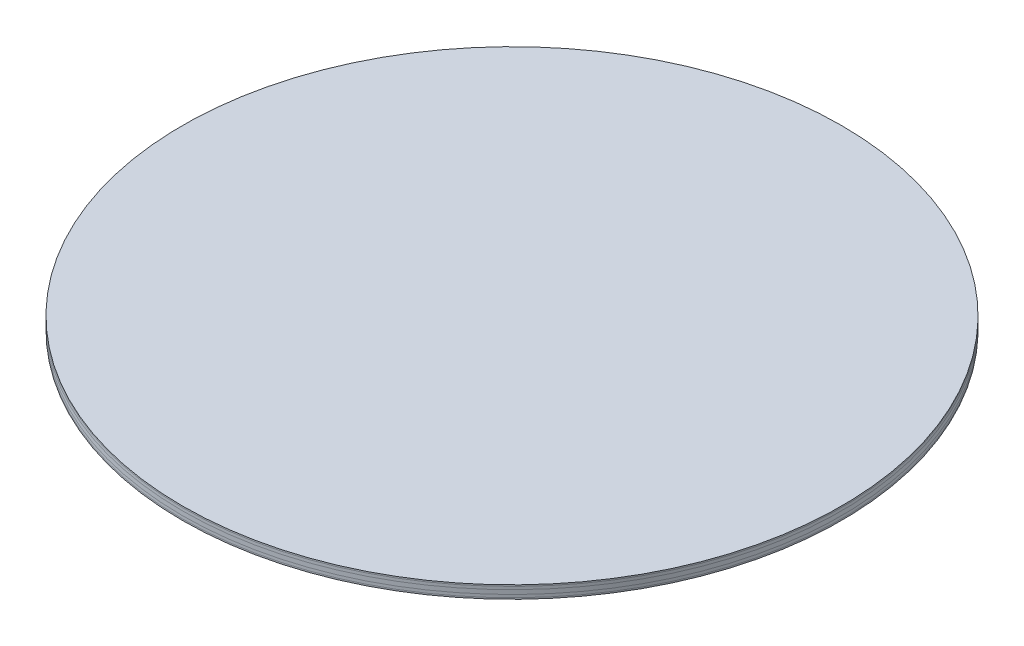
ISO-10303-21;
HEADER;
FILE_DESCRIPTION(('STEP AP214'),'2;1');
FILE_NAME('part.step','',(''),(''),'','','');
FILE_SCHEMA(('AUTOMOTIVE_DESIGN { 1 0 10303 214 1 1 1 1 }'));
ENDSEC;
DATA;
#1=APPLICATION_CONTEXT('core data for automotive mechanical design processes');
#2=APPLICATION_PROTOCOL_DEFINITION('international standard','automotive_design',2000,#1);
#3=PRODUCT_CONTEXT('',#1,'mechanical');
#4=PRODUCT('Part','Part','',(#3));
#5=PRODUCT_RELATED_PRODUCT_CATEGORY('part','',(#4));
#6=PRODUCT_DEFINITION_FORMATION('','',#4);
#7=PRODUCT_DEFINITION_CONTEXT('part definition',#1,'design');
#8=PRODUCT_DEFINITION('design','',#6,#7);
#9=PRODUCT_DEFINITION_SHAPE('','',#8);
#10=(LENGTH_UNIT() NAMED_UNIT(*) SI_UNIT(.MILLI.,.METRE.));
#11=(NAMED_UNIT(*) PLANE_ANGLE_UNIT() SI_UNIT($,.RADIAN.));
#12=(NAMED_UNIT(*) SI_UNIT($,.STERADIAN.) SOLID_ANGLE_UNIT());
#13=UNCERTAINTY_MEASURE_WITH_UNIT(LENGTH_MEASURE(1.E-05),#10,'distance_accuracy_value','');
#14=(GEOMETRIC_REPRESENTATION_CONTEXT(3) GLOBAL_UNCERTAINTY_ASSIGNED_CONTEXT((#13)) GLOBAL_UNIT_ASSIGNED_CONTEXT((#10,
#11,#12)) REPRESENTATION_CONTEXT('',''));
#15=CARTESIAN_POINT('',(0.,0.,0.));
#16=DIRECTION('',(0.,0.,1.));
#17=DIRECTION('',(1.,0.,0.));
#18=AXIS2_PLACEMENT_3D('',#15,#16,#17);
#19=CARTESIAN_POINT('',(0.,0.,0.));
#20=DIRECTION('',(0.,1.,0.));
#21=DIRECTION('',(0.,0.,1.));
#22=AXIS2_PLACEMENT_3D('',#19,#20,#21);
#23=PLANE('',#22);
#24=CARTESIAN_POINT('',(0.,0.,0.));
#25=DIRECTION('',(0.,1.,0.));
#26=DIRECTION('',(0.,0.,1.));
#27=AXIS2_PLACEMENT_3D('',#24,#25,#26);
#28=CIRCLE('',#27,500.);
#29=CARTESIAN_POINT('',(0.,0.,500.));
#30=VERTEX_POINT('',#29);
#31=EDGE_CURVE('E65',#30,#30,#28,.T.);
#32=ORIENTED_EDGE('',*,*,#31,.T.);
#33=EDGE_LOOP('',(#32));
#34=FACE_BOUND('',#33,.T.);
#35=ADVANCED_FACE('F58',(#34),#23,.T.);
#36=CARTESIAN_POINT('',(0.,-19.05,0.));
#37=DIRECTION('',(0.,1.,0.));
#38=DIRECTION('',(0.,0.,1.));
#39=AXIS2_PLACEMENT_3D('',#36,#37,#38);
#40=CYLINDRICAL_SURFACE('',#39,500.);
#41=CARTESIAN_POINT('',(0.,-2.11666666666654,0.));
#42=DIRECTION('',(0.,-1.,0.));
#43=DIRECTION('',(1.,0.,0.));
#44=AXIS2_PLACEMENT_3D('',#41,#42,#43);
#45=CIRCLE('',#44,500.);
#46=CARTESIAN_POINT('',(0.,-2.11666666666654,500.));
#47=VERTEX_POINT('',#46);
#48=EDGE_CURVE('E11',#47,#47,#45,.T.);
#49=CARTESIAN_POINT('',(0.,-2.11666666666654,500.));
#50=CARTESIAN_POINT('',(0.,-2.09461805555543,500.));
#51=CARTESIAN_POINT('',(0.,-2.07256944444432,500.));
#52=CARTESIAN_POINT('',(0.,-2.0284722222221,500.));
#53=CARTESIAN_POINT('',(0.,-2.00642361111099,500.));
#54=CARTESIAN_POINT('',(0.,-1.96232638888877,500.));
#55=CARTESIAN_POINT('',(0.,-1.94027777777766,500.));
#56=CARTESIAN_POINT('',(0.,-1.89618055555544,500.));
#57=CARTESIAN_POINT('',(0.,-1.87413194444433,500.));
#58=CARTESIAN_POINT('',(0.,-1.83003472222211,500.));
#59=CARTESIAN_POINT('',(0.,-1.807986111111,500.));
#60=CARTESIAN_POINT('',(0.,-1.76388888888878,500.));
#61=CARTESIAN_POINT('',(0.,-1.74184027777767,500.));
#62=CARTESIAN_POINT('',(0.,-1.69774305555545,500.));
#63=CARTESIAN_POINT('',(0.,-1.67569444444434,500.));
#64=CARTESIAN_POINT('',(0.,-1.63159722222212,500.));
#65=CARTESIAN_POINT('',(0.,-1.60954861111101,500.));
#66=CARTESIAN_POINT('',(0.,-1.56545138888879,500.));
#67=CARTESIAN_POINT('',(0.,-1.54340277777768,500.));
#68=CARTESIAN_POINT('',(0.,-1.49930555555547,500.));
#69=CARTESIAN_POINT('',(0.,-1.47725694444436,500.));
#70=CARTESIAN_POINT('',(0.,-1.43315972222214,500.));
#71=CARTESIAN_POINT('',(0.,-1.41111111111103,500.));
#72=CARTESIAN_POINT('',(0.,-1.36701388888881,500.));
#73=CARTESIAN_POINT('',(0.,-1.3449652777777,500.));
#74=CARTESIAN_POINT('',(0.,-1.30086805555548,500.));
#75=CARTESIAN_POINT('',(0.,-1.27881944444437,500.));
#76=CARTESIAN_POINT('',(0.,-1.23472222222215,500.));
#77=CARTESIAN_POINT('',(0.,-1.21267361111104,500.));
#78=CARTESIAN_POINT('',(0.,-1.16857638888882,500.));
#79=CARTESIAN_POINT('',(0.,-1.14652777777771,500.));
#80=CARTESIAN_POINT('',(0.,-1.10243055555549,500.));
#81=CARTESIAN_POINT('',(0.,-1.08038194444438,500.));
#82=CARTESIAN_POINT('',(0.,-1.03628472222216,500.));
#83=CARTESIAN_POINT('',(0.,-1.01423611111105,500.));
#84=CARTESIAN_POINT('',(0.,-0.970138888888829,500.));
#85=CARTESIAN_POINT('',(0.,-0.94809027777772,500.));
#86=CARTESIAN_POINT('',(0.,-0.9039930555555,500.));
#87=CARTESIAN_POINT('',(0.,-0.88194444444439,500.));
#88=CARTESIAN_POINT('',(0.,-0.83784722222217,500.));
#89=CARTESIAN_POINT('',(0.,-0.815798611111061,500.));
#90=CARTESIAN_POINT('',(0.,-0.771701388888841,500.));
#91=CARTESIAN_POINT('',(0.,-0.749652777777731,500.));
#92=CARTESIAN_POINT('',(0.,-0.705555555555511,500.));
#93=CARTESIAN_POINT('',(0.,-0.683506944444402,500.));
#94=CARTESIAN_POINT('',(0.,-0.639409722222182,500.));
#95=CARTESIAN_POINT('',(0.,-0.617361111111072,500.));
#96=CARTESIAN_POINT('',(0.,-0.573263888888853,500.));
#97=CARTESIAN_POINT('',(0.,-0.551215277777745,500.));
#98=CARTESIAN_POINT('',(0.,-0.507118055555526,500.));
#99=CARTESIAN_POINT('',(0.,-0.485069444444416,500.));
#100=CARTESIAN_POINT('',(0.,-0.440972222222197,500.));
#101=CARTESIAN_POINT('',(0.,-0.418923611111087,500.));
#102=CARTESIAN_POINT('',(0.,-0.374826388888867,500.));
#103=CARTESIAN_POINT('',(0.,-0.352777777777757,500.));
#104=CARTESIAN_POINT('',(0.,-0.308680555555538,500.));
#105=CARTESIAN_POINT('',(0.,-0.286631944444428,500.));
#106=CARTESIAN_POINT('',(0.,-0.242534722222208,500.));
#107=CARTESIAN_POINT('',(0.,-0.220486111111098,500.));
#108=CARTESIAN_POINT('',(0.,-0.176388888888879,500.));
#109=CARTESIAN_POINT('',(0.,-0.154340277777769,500.));
#110=CARTESIAN_POINT('',(0.,-0.110243055555549,500.));
#111=CARTESIAN_POINT('',(0.,-0.0881944444444394,500.));
#112=CARTESIAN_POINT('',(0.,-0.0440972222222197,500.));
#113=CARTESIAN_POINT('',(0.,-0.0220486111111098,500.));
#114=CARTESIAN_POINT('',(0.,0.,500.));
#115=B_SPLINE_CURVE_WITH_KNOTS('',3,(#49,#50,#51,#52,#53,#54,#55,#56,#57,#58,#59,#60,#61,#62,
#63,#64,#65,#66,#67,#68,#69,#70,#71,#72,#73,#74,#75,#76,#77,#78,#79,#80,#81,#82,#83,#84,#85,#86,
#87,#88,#89,#90,#91,#92,#93,#94,#95,#96,#97,#98,#99,#100,#101,#102,#103,#104,#105,#106,#107,
#108,#109,#110,#111,#112,#113,#114),.UNSPECIFIED.,.F.,.F.,(4,2,2,2,2,2,2,2,2,2,2,2,2,2,2,2,2,2,
2,2,2,2,2,2,2,2,2,2,2,2,2,2,4),(0.,0.0661458333333295,0.132291666666659,0.198437499999989,
0.264583333333318,0.330729166666648,0.396874999999977,0.463020833333307,0.529166666666636,
0.595312499999962,0.661458333333292,0.727604166666621,0.793749999999951,0.85989583333328,
0.92604166666661,0.992187499999939,1.05833333333327,1.1244791666666,1.19062499999993,
1.25677083333326,1.32291666666659,1.38906249999992,1.45520833333325,1.52135416666658,
1.5874999999999,1.65364583333323,1.71979166666656,1.78593749999989,1.85208333333322,
1.91822916666655,1.98437499999988,2.05052083333321,2.11666666666654),.UNSPECIFIED.);
#116=EDGE_CURVE('BSEAM72',#47,#30,#115,.T.);
#117=ORIENTED_EDGE('',*,*,#48,.F.);
#118=ORIENTED_EDGE('',*,*,#31,.F.);
#119=ORIENTED_EDGE('',*,*,#116,.T.);
#120=ORIENTED_EDGE('',*,*,#116,.F.);
#121=EDGE_LOOP('',(#117,#119,#118,#120));
#122=FACE_BOUND('',#121,.T.);
#123=ADVANCED_FACE('F72',(#122),#40,.T.);
#124=CARTESIAN_POINT('',(-670.56,-2.11666666666667,-609.61));
#125=DIRECTION('',(0.,-1.,0.));
#126=DIRECTION('',(1.,0.,0.));
#127=AXIS2_PLACEMENT_3D('',#124,#125,#126);
#128=PLANE('',#127);
#129=ORIENTED_EDGE('',*,*,#48,.T.);
#130=EDGE_LOOP('',(#129));
#131=FACE_BOUND('',#130,.T.);
#132=ADVANCED_FACE('F60',(#131),#128,.T.);
#133=CLOSED_SHELL('',(#35,#123,#132));
#134=MANIFOLD_SOLID_BREP('B2',#133);
#135=CARTESIAN_POINT('',(0.,-19.05,0.));
#136=DIRECTION('',(0.,1.,0.));
#137=DIRECTION('',(0.,0.,1.));
#138=AXIS2_PLACEMENT_3D('',#135,#136,#137);
#139=PLANE('',#138);
#140=CARTESIAN_POINT('',(0.,-19.05,0.));
#141=DIRECTION('',(0.,1.,0.));
#142=DIRECTION('',(0.,0.,1.));
#143=AXIS2_PLACEMENT_3D('',#140,#141,#142);
#144=CIRCLE('',#143,500.);
#145=CARTESIAN_POINT('',(0.,-19.05,500.));
#146=VERTEX_POINT('',#145);
#147=EDGE_CURVE('E126',#146,#146,#144,.T.);
#148=ORIENTED_EDGE('',*,*,#147,.F.);
#149=EDGE_LOOP('',(#148));
#150=FACE_BOUND('',#149,.T.);
#151=ADVANCED_FACE('F119',(#150),#139,.F.);
#152=CARTESIAN_POINT('',(0.,-19.05,0.));
#153=DIRECTION('',(0.,1.,0.));
#154=DIRECTION('',(0.,0.,1.));
#155=AXIS2_PLACEMENT_3D('',#152,#153,#154);
#156=CYLINDRICAL_SURFACE('',#155,500.);
#157=CARTESIAN_POINT('',(0.,-16.9333333333332,0.));
#158=DIRECTION('',(0.,-1.,0.));
#159=DIRECTION('',(1.,0.,0.));
#160=AXIS2_PLACEMENT_3D('',#157,#158,#159);
#161=CIRCLE('',#160,500.);
#162=CARTESIAN_POINT('',(0.,-16.9333333333332,500.));
#163=VERTEX_POINT('',#162);
#164=EDGE_CURVE('E57',#163,#163,#161,.T.);
#165=CARTESIAN_POINT('',(0.,-19.05,500.));
#166=CARTESIAN_POINT('',(0.,-19.0279513888889,500.));
#167=CARTESIAN_POINT('',(0.,-19.0059027777778,500.));
#168=CARTESIAN_POINT('',(0.,-18.9618055555556,500.));
#169=CARTESIAN_POINT('',(0.,-18.9397569444444,500.));
#170=CARTESIAN_POINT('',(0.,-18.8956597222222,500.));
#171=CARTESIAN_POINT('',(0.,-18.8736111111111,500.));
#172=CARTESIAN_POINT('',(0.,-18.8295138888889,500.));
#173=CARTESIAN_POINT('',(0.,-18.8074652777778,500.));
#174=CARTESIAN_POINT('',(0.,-18.7633680555555,500.));
#175=CARTESIAN_POINT('',(0.,-18.7413194444444,500.));
#176=CARTESIAN_POINT('',(0.,-18.6972222222222,500.));
#177=CARTESIAN_POINT('',(0.,-18.6751736111111,500.));
#178=CARTESIAN_POINT('',(0.,-18.6310763888889,500.));
#179=CARTESIAN_POINT('',(0.,-18.6090277777778,500.));
#180=CARTESIAN_POINT('',(0.,-18.5649305555555,500.));
#181=CARTESIAN_POINT('',(0.,-18.5428819444444,500.));
#182=CARTESIAN_POINT('',(0.,-18.4987847222222,500.));
#183=CARTESIAN_POINT('',(0.,-18.4767361111111,500.));
#184=CARTESIAN_POINT('',(0.,-18.4326388888889,500.));
#185=CARTESIAN_POINT('',(0.,-18.4105902777777,500.));
#186=CARTESIAN_POINT('',(0.,-18.3664930555555,500.));
#187=CARTESIAN_POINT('',(0.,-18.3444444444444,500.));
#188=CARTESIAN_POINT('',(0.,-18.3003472222222,500.));
#189=CARTESIAN_POINT('',(0.,-18.2782986111111,500.));
#190=CARTESIAN_POINT('',(0.,-18.2342013888888,500.));
#191=CARTESIAN_POINT('',(0.,-18.2121527777777,500.));
#192=CARTESIAN_POINT('',(0.,-18.1680555555555,500.));
#193=CARTESIAN_POINT('',(0.,-18.1460069444444,500.));
#194=CARTESIAN_POINT('',(0.,-18.1019097222222,500.));
#195=CARTESIAN_POINT('',(0.,-18.0798611111111,500.));
#196=CARTESIAN_POINT('',(0.,-18.0357638888888,500.));
#197=CARTESIAN_POINT('',(0.,-18.0137152777777,500.));
#198=CARTESIAN_POINT('',(0.,-17.9696180555555,500.));
#199=CARTESIAN_POINT('',(0.,-17.9475694444444,500.));
#200=CARTESIAN_POINT('',(0.,-17.9034722222222,500.));
#201=CARTESIAN_POINT('',(0.,-17.881423611111,500.));
#202=CARTESIAN_POINT('',(0.,-17.8373263888888,500.));
#203=CARTESIAN_POINT('',(0.,-17.8152777777777,500.));
#204=CARTESIAN_POINT('',(0.,-17.7711805555555,500.));
#205=CARTESIAN_POINT('',(0.,-17.7491319444444,500.));
#206=CARTESIAN_POINT('',(0.,-17.7050347222221,500.));
#207=CARTESIAN_POINT('',(0.,-17.682986111111,500.));
#208=CARTESIAN_POINT('',(0.,-17.6388888888888,500.));
#209=CARTESIAN_POINT('',(0.,-17.6168402777777,500.));
#210=CARTESIAN_POINT('',(0.,-17.5727430555555,500.));
#211=CARTESIAN_POINT('',(0.,-17.5506944444444,500.));
#212=CARTESIAN_POINT('',(0.,-17.5065972222221,500.));
#213=CARTESIAN_POINT('',(0.,-17.484548611111,500.));
#214=CARTESIAN_POINT('',(0.,-17.4404513888888,500.));
#215=CARTESIAN_POINT('',(0.,-17.4184027777777,500.));
#216=CARTESIAN_POINT('',(0.,-17.3743055555555,500.));
#217=CARTESIAN_POINT('',(0.,-17.3522569444443,500.));
#218=CARTESIAN_POINT('',(0.,-17.3081597222221,500.));
#219=CARTESIAN_POINT('',(0.,-17.286111111111,500.));
#220=CARTESIAN_POINT('',(0.,-17.2420138888888,500.));
#221=CARTESIAN_POINT('',(0.,-17.2199652777777,500.));
#222=CARTESIAN_POINT('',(0.,-17.1758680555554,500.));
#223=CARTESIAN_POINT('',(0.,-17.1538194444443,500.));
#224=CARTESIAN_POINT('',(0.,-17.1097222222221,500.));
#225=CARTESIAN_POINT('',(0.,-17.087673611111,500.));
#226=CARTESIAN_POINT('',(0.,-17.0435763888888,500.));
#227=CARTESIAN_POINT('',(0.,-17.0215277777777,500.));
#228=CARTESIAN_POINT('',(0.,-16.9774305555554,500.));
#229=CARTESIAN_POINT('',(0.,-16.9553819444443,500.));
#230=CARTESIAN_POINT('',(0.,-16.9333333333332,500.));
#231=B_SPLINE_CURVE_WITH_KNOTS('',3,(#165,#166,#167,#168,#169,#170,#171,#172,#173,#174,#175,
#176,#177,#178,#179,#180,#181,#182,#183,#184,#185,#186,#187,#188,#189,#190,#191,#192,#193,#194,
#195,#196,#197,#198,#199,#200,#201,#202,#203,#204,#205,#206,#207,#208,#209,#210,#211,#212,#213,
#214,#215,#216,#217,#218,#219,#220,#221,#222,#223,#224,#225,#226,#227,#228,#229,#230),
.UNSPECIFIED.,.F.,.F.,(4,2,2,2,2,2,2,2,2,2,2,2,2,2,2,2,2,2,2,2,2,2,2,2,2,2,2,2,2,2,2,2,4),(0.,
0.0661458333333365,0.132291666666673,0.198437500000009,0.264583333333349,0.330729166666686,
0.396875000000022,0.463020833333359,0.529166666666699,0.595312500000035,0.661458333333371,
0.727604166666708,0.793750000000048,0.859895833333384,0.926041666666721,0.992187500000057,
1.0583333333334,1.12447916666673,1.19062500000007,1.25677083333341,1.32291666666675,
1.38906250000008,1.45520833333342,1.52135416666676,1.5875000000001,1.65364583333343,
1.71979166666677,1.78593750000011,1.85208333333344,1.91822916666678,1.98437500000012,
2.05052083333345,2.11666666666679),.UNSPECIFIED.);
#232=EDGE_CURVE('BSEAM132',#146,#163,#231,.T.);
#233=ORIENTED_EDGE('',*,*,#147,.T.);
#234=ORIENTED_EDGE('',*,*,#164,.T.);
#235=ORIENTED_EDGE('',*,*,#232,.T.);
#236=ORIENTED_EDGE('',*,*,#232,.F.);
#237=EDGE_LOOP('',(#233,#235,#234,#236));
#238=FACE_BOUND('',#237,.T.);
#239=ADVANCED_FACE('F132',(#238),#156,.T.);
#240=CARTESIAN_POINT('',(-670.56,-16.9333333333333,-609.61));
#241=DIRECTION('',(0.,-1.,0.));
#242=DIRECTION('',(1.,0.,0.));
#243=AXIS2_PLACEMENT_3D('',#240,#241,#242);
#244=PLANE('',#243);
#245=ORIENTED_EDGE('',*,*,#164,.F.);
#246=EDGE_LOOP('',(#245));
#247=FACE_BOUND('',#246,.T.);
#248=ADVANCED_FACE('F121',(#247),#244,.F.);
#249=CLOSED_SHELL('',(#151,#239,#248));
#250=MANIFOLD_SOLID_BREP('B6',#249);
#251=CARTESIAN_POINT('',(-670.56,-16.9333333333333,-609.61));
#252=DIRECTION('',(0.,-1.,0.));
#253=DIRECTION('',(1.,0.,0.));
#254=AXIS2_PLACEMENT_3D('',#251,#252,#253);
#255=PLANE('',#254);
#256=CARTESIAN_POINT('',(0.,-16.9333333333332,0.));
#257=DIRECTION('',(0.,-1.,0.));
#258=DIRECTION('',(1.,0.,0.));
#259=AXIS2_PLACEMENT_3D('',#256,#257,#258);
#260=CIRCLE('',#259,500.);
#261=CARTESIAN_POINT('',(0.,-16.9333333333332,500.));
#262=VERTEX_POINT('',#261);
#263=EDGE_CURVE('E183',#262,#262,#260,.T.);
#264=ORIENTED_EDGE('',*,*,#263,.T.);
#265=EDGE_LOOP('',(#264));
#266=FACE_BOUND('',#265,.T.);
#267=ADVANCED_FACE('F180',(#266),#255,.T.);
#268=CARTESIAN_POINT('',(0.,-19.05,0.));
#269=DIRECTION('',(0.,1.,0.));
#270=DIRECTION('',(0.,0.,1.));
#271=AXIS2_PLACEMENT_3D('',#268,#269,#270);
#272=CYLINDRICAL_SURFACE('',#271,500.);
#273=CARTESIAN_POINT('',(0.,-12.6999999999999,0.));
#274=DIRECTION('',(0.,-1.,0.));
#275=DIRECTION('',(1.,0.,0.));
#276=AXIS2_PLACEMENT_3D('',#273,#274,#275);
#277=CIRCLE('',#276,500.);
#278=CARTESIAN_POINT('',(0.,-12.6999999999999,500.));
#279=VERTEX_POINT('',#278);
#280=EDGE_CURVE('E118',#279,#279,#277,.T.);
#281=CARTESIAN_POINT('',(0.,-16.9333333333332,500.));
#282=CARTESIAN_POINT('',(0.,-16.889236111111,500.));
#283=CARTESIAN_POINT('',(0.,-16.8451388888888,500.));
#284=CARTESIAN_POINT('',(0.,-16.7569444444443,500.));
#285=CARTESIAN_POINT('',(0.,-16.7128472222221,500.));
#286=CARTESIAN_POINT('',(0.,-16.6246527777777,500.));
#287=CARTESIAN_POINT('',(0.,-16.5805555555554,500.));
#288=CARTESIAN_POINT('',(0.,-16.492361111111,500.));
#289=CARTESIAN_POINT('',(0.,-16.4482638888888,500.));
#290=CARTESIAN_POINT('',(0.,-16.3600694444443,500.));
#291=CARTESIAN_POINT('',(0.,-16.3159722222221,500.));
#292=CARTESIAN_POINT('',(0.,-16.2277777777776,500.));
#293=CARTESIAN_POINT('',(0.,-16.1836805555554,500.));
#294=CARTESIAN_POINT('',(0.,-16.095486111111,500.));
#295=CARTESIAN_POINT('',(0.,-16.0513888888888,500.));
#296=CARTESIAN_POINT('',(0.,-15.9631944444443,500.));
#297=CARTESIAN_POINT('',(0.,-15.9190972222221,500.));
#298=CARTESIAN_POINT('',(0.,-15.8309027777777,500.));
#299=CARTESIAN_POINT('',(0.,-15.7868055555554,500.));
#300=CARTESIAN_POINT('',(0.,-15.698611111111,500.));
#301=CARTESIAN_POINT('',(0.,-15.6545138888888,500.));
#302=CARTESIAN_POINT('',(0.,-15.5663194444443,500.));
#303=CARTESIAN_POINT('',(0.,-15.5222222222221,500.));
#304=CARTESIAN_POINT('',(0.,-15.4340277777777,500.));
#305=CARTESIAN_POINT('',(0.,-15.3899305555554,500.));
#306=CARTESIAN_POINT('',(0.,-15.301736111111,500.));
#307=CARTESIAN_POINT('',(0.,-15.2576388888888,500.));
#308=CARTESIAN_POINT('',(0.,-15.1694444444443,500.));
#309=CARTESIAN_POINT('',(0.,-15.1253472222221,500.));
#310=CARTESIAN_POINT('',(0.,-15.0371527777777,500.));
#311=CARTESIAN_POINT('',(0.,-14.9930555555554,500.));
#312=CARTESIAN_POINT('',(0.,-14.904861111111,500.));
#313=CARTESIAN_POINT('',(0.,-14.8607638888888,500.));
#314=CARTESIAN_POINT('',(0.,-14.7725694444443,500.));
#315=CARTESIAN_POINT('',(0.,-14.7284722222221,500.));
#316=CARTESIAN_POINT('',(0.,-14.6402777777777,500.));
#317=CARTESIAN_POINT('',(0.,-14.5961805555554,500.));
#318=CARTESIAN_POINT('',(0.,-14.507986111111,500.));
#319=CARTESIAN_POINT('',(0.,-14.4638888888888,500.));
#320=CARTESIAN_POINT('',(0.,-14.3756944444443,500.));
#321=CARTESIAN_POINT('',(0.,-14.3315972222221,500.));
#322=CARTESIAN_POINT('',(0.,-14.2434027777777,500.));
#323=CARTESIAN_POINT('',(0.,-14.1993055555554,500.));
#324=CARTESIAN_POINT('',(0.,-14.111111111111,500.));
#325=CARTESIAN_POINT('',(0.,-14.0670138888888,500.));
#326=CARTESIAN_POINT('',(0.,-13.9788194444443,500.));
#327=CARTESIAN_POINT('',(0.,-13.9347222222221,500.));
#328=CARTESIAN_POINT('',(0.,-13.8465277777777,500.));
#329=CARTESIAN_POINT('',(0.,-13.8024305555554,500.));
#330=CARTESIAN_POINT('',(0.,-13.714236111111,500.));
#331=CARTESIAN_POINT('',(0.,-13.6701388888888,500.));
#332=CARTESIAN_POINT('',(0.,-13.5819444444443,500.));
#333=CARTESIAN_POINT('',(0.,-13.5378472222221,500.));
#334=CARTESIAN_POINT('',(0.,-13.4496527777777,500.));
#335=CARTESIAN_POINT('',(0.,-13.4055555555554,500.));
#336=CARTESIAN_POINT('',(0.,-13.317361111111,500.));
#337=CARTESIAN_POINT('',(0.,-13.2732638888888,500.));
#338=CARTESIAN_POINT('',(0.,-13.1850694444443,500.));
#339=CARTESIAN_POINT('',(0.,-13.1409722222221,500.));
#340=CARTESIAN_POINT('',(0.,-13.0527777777777,500.));
#341=CARTESIAN_POINT('',(0.,-13.0086805555554,500.));
#342=CARTESIAN_POINT('',(0.,-12.920486111111,500.));
#343=CARTESIAN_POINT('',(0.,-12.8763888888888,500.));
#344=CARTESIAN_POINT('',(0.,-12.7881944444443,500.));
#345=CARTESIAN_POINT('',(0.,-12.7440972222221,500.));
#346=CARTESIAN_POINT('',(0.,-12.6999999999999,500.));
#347=B_SPLINE_CURVE_WITH_KNOTS('',3,(#281,#282,#283,#284,#285,#286,#287,#288,#289,#290,#291,
#292,#293,#294,#295,#296,#297,#298,#299,#300,#301,#302,#303,#304,#305,#306,#307,#308,#309,#310,
#311,#312,#313,#314,#315,#316,#317,#318,#319,#320,#321,#322,#323,#324,#325,#326,#327,#328,#329,
#330,#331,#332,#333,#334,#335,#336,#337,#338,#339,#340,#341,#342,#343,#344,#345,#346),
.UNSPECIFIED.,.F.,.F.,(4,2,2,2,2,2,2,2,2,2,2,2,2,2,2,2,2,2,2,2,2,2,2,2,2,2,2,2,2,2,2,2,4),(0.,
0.132291666666666,0.264583333333332,0.396874999999998,0.529166666666664,0.661458333333333,
0.793749999999999,0.926041666666665,1.05833333333333,1.190625,1.32291666666666,1.45520833333333,
1.5875,1.71979166666666,1.85208333333333,1.984375,2.11666666666667,2.24895833333333,2.38125,
2.51354166666666,2.64583333333333,2.778125,2.91041666666667,3.04270833333333,3.175,
3.30729166666666,3.43958333333333,3.571875,3.70416666666666,3.83645833333333,3.96875,
4.10104166666666,4.23333333333333),.UNSPECIFIED.);
#348=EDGE_CURVE('BSEAM193',#262,#279,#347,.T.);
#349=ORIENTED_EDGE('',*,*,#263,.F.);
#350=ORIENTED_EDGE('',*,*,#280,.T.);
#351=ORIENTED_EDGE('',*,*,#348,.T.);
#352=ORIENTED_EDGE('',*,*,#348,.F.);
#353=EDGE_LOOP('',(#349,#351,#350,#352));
#354=FACE_BOUND('',#353,.T.);
#355=ADVANCED_FACE('F193',(#354),#272,.T.);
#356=CARTESIAN_POINT('',(-670.56,-12.7,-609.61));
#357=DIRECTION('',(0.,-1.,0.));
#358=DIRECTION('',(1.,0.,0.));
#359=AXIS2_PLACEMENT_3D('',#356,#357,#358);
#360=PLANE('',#359);
#361=ORIENTED_EDGE('',*,*,#280,.F.);
#362=EDGE_LOOP('',(#361));
#363=FACE_BOUND('',#362,.T.);
#364=ADVANCED_FACE('F195',(#363),#360,.F.);
#365=CLOSED_SHELL('',(#267,#355,#364));
#366=MANIFOLD_SOLID_BREP('B52',#365);
#367=CARTESIAN_POINT('',(-670.56,-12.7,-609.61));
#368=DIRECTION('',(0.,-1.,0.));
#369=DIRECTION('',(1.,0.,0.));
#370=AXIS2_PLACEMENT_3D('',#367,#368,#369);
#371=PLANE('',#370);
#372=CARTESIAN_POINT('',(0.,-12.6999999999999,0.));
#373=DIRECTION('',(0.,-1.,0.));
#374=DIRECTION('',(1.,0.,0.));
#375=AXIS2_PLACEMENT_3D('',#372,#373,#374);
#376=CIRCLE('',#375,500.);
#377=CARTESIAN_POINT('',(0.,-12.6999999999999,500.));
#378=VERTEX_POINT('',#377);
#379=EDGE_CURVE('E243',#378,#378,#376,.T.);
#380=ORIENTED_EDGE('',*,*,#379,.T.);
#381=EDGE_LOOP('',(#380));
#382=FACE_BOUND('',#381,.T.);
#383=ADVANCED_FACE('F240',(#382),#371,.T.);
#384=CARTESIAN_POINT('',(0.,-19.05,0.));
#385=DIRECTION('',(0.,1.,0.));
#386=DIRECTION('',(0.,0.,1.));
#387=AXIS2_PLACEMENT_3D('',#384,#385,#386);
#388=CYLINDRICAL_SURFACE('',#387,500.);
#389=CARTESIAN_POINT('',(0.,-6.34999999999988,0.));
#390=DIRECTION('',(0.,-1.,0.));
#391=DIRECTION('',(1.,0.,0.));
#392=AXIS2_PLACEMENT_3D('',#389,#390,#391);
#393=CIRCLE('',#392,500.);
#394=CARTESIAN_POINT('',(0.,-6.34999999999988,500.));
#395=VERTEX_POINT('',#394);
#396=EDGE_CURVE('E179',#395,#395,#393,.T.);
#397=CARTESIAN_POINT('',(0.,-12.6999999999999,500.));
#398=CARTESIAN_POINT('',(0.,-12.6338541666665,500.));
#399=CARTESIAN_POINT('',(0.,-12.5677083333332,500.));
#400=CARTESIAN_POINT('',(0.,-12.4354166666665,500.));
#401=CARTESIAN_POINT('',(0.,-12.3692708333332,500.));
#402=CARTESIAN_POINT('',(0.,-12.2369791666665,500.));
#403=CARTESIAN_POINT('',(0.,-12.1708333333332,500.));
#404=CARTESIAN_POINT('',(0.,-12.0385416666665,500.));
#405=CARTESIAN_POINT('',(0.,-11.9723958333332,500.));
#406=CARTESIAN_POINT('',(0.,-11.8401041666665,500.));
#407=CARTESIAN_POINT('',(0.,-11.7739583333332,500.));
#408=CARTESIAN_POINT('',(0.,-11.6416666666665,500.));
#409=CARTESIAN_POINT('',(0.,-11.5755208333332,500.));
#410=CARTESIAN_POINT('',(0.,-11.4432291666665,500.));
#411=CARTESIAN_POINT('',(0.,-11.3770833333332,500.));
#412=CARTESIAN_POINT('',(0.,-11.2447916666665,500.));
#413=CARTESIAN_POINT('',(0.,-11.1786458333332,500.));
#414=CARTESIAN_POINT('',(0.,-11.0463541666665,500.));
#415=CARTESIAN_POINT('',(0.,-10.9802083333332,500.));
#416=CARTESIAN_POINT('',(0.,-10.8479166666665,500.));
#417=CARTESIAN_POINT('',(0.,-10.7817708333332,500.));
#418=CARTESIAN_POINT('',(0.,-10.6494791666665,500.));
#419=CARTESIAN_POINT('',(0.,-10.5833333333332,500.));
#420=CARTESIAN_POINT('',(0.,-10.4510416666665,500.));
#421=CARTESIAN_POINT('',(0.,-10.3848958333332,500.));
#422=CARTESIAN_POINT('',(0.,-10.2526041666665,500.));
#423=CARTESIAN_POINT('',(0.,-10.1864583333332,500.));
#424=CARTESIAN_POINT('',(0.,-10.0541666666665,500.));
#425=CARTESIAN_POINT('',(0.,-9.98802083333321,500.));
#426=CARTESIAN_POINT('',(0.,-9.85572916666654,500.));
#427=CARTESIAN_POINT('',(0.,-9.78958333333321,500.));
#428=CARTESIAN_POINT('',(0.,-9.65729166666654,500.));
#429=CARTESIAN_POINT('',(0.,-9.59114583333321,500.));
#430=CARTESIAN_POINT('',(0.,-9.45885416666654,500.));
#431=CARTESIAN_POINT('',(0.,-9.39270833333321,500.));
#432=CARTESIAN_POINT('',(0.,-9.26041666666654,500.));
#433=CARTESIAN_POINT('',(0.,-9.19427083333321,500.));
#434=CARTESIAN_POINT('',(0.,-9.06197916666654,500.));
#435=CARTESIAN_POINT('',(0.,-8.99583333333321,500.));
#436=CARTESIAN_POINT('',(0.,-8.86354166666654,500.));
#437=CARTESIAN_POINT('',(0.,-8.79739583333321,500.));
#438=CARTESIAN_POINT('',(0.,-8.66510416666654,500.));
#439=CARTESIAN_POINT('',(0.,-8.59895833333321,500.));
#440=CARTESIAN_POINT('',(0.,-8.46666666666654,500.));
#441=CARTESIAN_POINT('',(0.,-8.40052083333321,500.));
#442=CARTESIAN_POINT('',(0.,-8.26822916666655,500.));
#443=CARTESIAN_POINT('',(0.,-8.20208333333321,500.));
#444=CARTESIAN_POINT('',(0.,-8.06979166666654,500.));
#445=CARTESIAN_POINT('',(0.,-8.00364583333321,500.));
#446=CARTESIAN_POINT('',(0.,-7.87135416666654,500.));
#447=CARTESIAN_POINT('',(0.,-7.80520833333321,500.));
#448=CARTESIAN_POINT('',(0.,-7.67291666666654,500.));
#449=CARTESIAN_POINT('',(0.,-7.60677083333321,500.));
#450=CARTESIAN_POINT('',(0.,-7.47447916666655,500.));
#451=CARTESIAN_POINT('',(0.,-7.40833333333321,500.));
#452=CARTESIAN_POINT('',(0.,-7.27604166666654,500.));
#453=CARTESIAN_POINT('',(0.,-7.20989583333321,500.));
#454=CARTESIAN_POINT('',(0.,-7.07760416666654,500.));
#455=CARTESIAN_POINT('',(0.,-7.01145833333321,500.));
#456=CARTESIAN_POINT('',(0.,-6.87916666666654,500.));
#457=CARTESIAN_POINT('',(0.,-6.81302083333321,500.));
#458=CARTESIAN_POINT('',(0.,-6.68072916666654,500.));
#459=CARTESIAN_POINT('',(0.,-6.61458333333321,500.));
#460=CARTESIAN_POINT('',(0.,-6.48229166666654,500.));
#461=CARTESIAN_POINT('',(0.,-6.41614583333321,500.));
#462=CARTESIAN_POINT('',(0.,-6.34999999999988,500.));
#463=B_SPLINE_CURVE_WITH_KNOTS('',3,(#397,#398,#399,#400,#401,#402,#403,#404,#405,#406,#407,
#408,#409,#410,#411,#412,#413,#414,#415,#416,#417,#418,#419,#420,#421,#422,#423,#424,#425,#426,
#427,#428,#429,#430,#431,#432,#433,#434,#435,#436,#437,#438,#439,#440,#441,#442,#443,#444,#445,
#446,#447,#448,#449,#450,#451,#452,#453,#454,#455,#456,#457,#458,#459,#460,#461,#462),
.UNSPECIFIED.,.F.,.F.,(4,2,2,2,2,2,2,2,2,2,2,2,2,2,2,2,2,2,2,2,2,2,2,2,2,2,2,2,2,2,2,2,4),(0.,
0.198437499999999,0.396874999999998,0.595312499999999,0.793749999999999,0.992187499999998,
1.190625,1.3890625,1.5875,1.7859375,1.984375,2.1828125,2.38125,2.5796875,2.778125,2.9765625,
3.175,3.3734375,3.571875,3.7703125,3.96875,4.1671875,4.365625,4.5640625,4.7625,4.9609375,
5.159375,5.3578125,5.55625,5.7546875,5.953125,6.1515625,6.35),.UNSPECIFIED.);
#464=EDGE_CURVE('BSEAM255',#378,#395,#463,.T.);
#465=ORIENTED_EDGE('',*,*,#379,.F.);
#466=ORIENTED_EDGE('',*,*,#396,.T.);
#467=ORIENTED_EDGE('',*,*,#464,.T.);
#468=ORIENTED_EDGE('',*,*,#464,.F.);
#469=EDGE_LOOP('',(#465,#467,#466,#468));
#470=FACE_BOUND('',#469,.T.);
#471=ADVANCED_FACE('F255',(#470),#388,.T.);
#472=CARTESIAN_POINT('',(-670.56,-6.35,-609.61));
#473=DIRECTION('',(0.,-1.,0.));
#474=DIRECTION('',(1.,0.,0.));
#475=AXIS2_PLACEMENT_3D('',#472,#473,#474);
#476=PLANE('',#475);
#477=ORIENTED_EDGE('',*,*,#396,.F.);
#478=EDGE_LOOP('',(#477));
#479=FACE_BOUND('',#478,.T.);
#480=ADVANCED_FACE('F257',(#479),#476,.F.);
#481=CLOSED_SHELL('',(#383,#471,#480));
#482=MANIFOLD_SOLID_BREP('B113',#481);
#483=CARTESIAN_POINT('',(-670.56,-6.35,-609.61));
#484=DIRECTION('',(0.,-1.,0.));
#485=DIRECTION('',(1.,0.,0.));
#486=AXIS2_PLACEMENT_3D('',#483,#484,#485);
#487=PLANE('',#486);
#488=CARTESIAN_POINT('',(0.,-6.34999999999988,0.));
#489=DIRECTION('',(0.,-1.,0.));
#490=DIRECTION('',(1.,0.,0.));
#491=AXIS2_PLACEMENT_3D('',#488,#489,#490);
#492=CIRCLE('',#491,500.);
#493=CARTESIAN_POINT('',(0.,-6.34999999999988,500.));
#494=VERTEX_POINT('',#493);
#495=EDGE_CURVE('E299',#494,#494,#492,.T.);
#496=ORIENTED_EDGE('',*,*,#495,.T.);
#497=EDGE_LOOP('',(#496));
#498=FACE_BOUND('',#497,.T.);
#499=ADVANCED_FACE('F295',(#498),#487,.T.);
#500=CARTESIAN_POINT('',(0.,-19.05,0.));
#501=DIRECTION('',(0.,1.,0.));
#502=DIRECTION('',(0.,0.,1.));
#503=AXIS2_PLACEMENT_3D('',#500,#501,#502);
#504=CYLINDRICAL_SURFACE('',#503,500.);
#505=CARTESIAN_POINT('',(0.,-2.11666666666654,0.));
#506=DIRECTION('',(0.,-1.,0.));
#507=DIRECTION('',(1.,0.,0.));
#508=AXIS2_PLACEMENT_3D('',#505,#506,#507);
#509=CIRCLE('',#508,500.);
#510=CARTESIAN_POINT('',(0.,-2.11666666666654,500.));
#511=VERTEX_POINT('',#510);
#512=EDGE_CURVE('E239',#511,#511,#509,.T.);
#513=CARTESIAN_POINT('',(0.,-6.34999999999988,500.));
#514=CARTESIAN_POINT('',(0.,-6.30590277777766,500.));
#515=CARTESIAN_POINT('',(0.,-6.26180555555543,500.));
#516=CARTESIAN_POINT('',(0.,-6.17361111111099,500.));
#517=CARTESIAN_POINT('',(0.,-6.12951388888877,500.));
#518=CARTESIAN_POINT('',(0.,-6.04131944444432,500.));
#519=CARTESIAN_POINT('',(0.,-5.9972222222221,500.));
#520=CARTESIAN_POINT('',(0.,-5.90902777777765,500.));
#521=CARTESIAN_POINT('',(0.,-5.86493055555543,500.));
#522=CARTESIAN_POINT('',(0.,-5.77673611111099,500.));
#523=CARTESIAN_POINT('',(0.,-5.73263888888877,500.));
#524=CARTESIAN_POINT('',(0.,-5.64444444444432,500.));
#525=CARTESIAN_POINT('',(0.,-5.6003472222221,500.));
#526=CARTESIAN_POINT('',(0.,-5.51215277777766,500.));
#527=CARTESIAN_POINT('',(0.,-5.46805555555543,500.));
#528=CARTESIAN_POINT('',(0.,-5.37986111111099,500.));
#529=CARTESIAN_POINT('',(0.,-5.33576388888877,500.));
#530=CARTESIAN_POINT('',(0.,-5.24756944444432,500.));
#531=CARTESIAN_POINT('',(0.,-5.2034722222221,500.));
#532=CARTESIAN_POINT('',(0.,-5.11527777777765,500.));
#533=CARTESIAN_POINT('',(0.,-5.07118055555543,500.));
#534=CARTESIAN_POINT('',(0.,-4.98298611111099,500.));
#535=CARTESIAN_POINT('',(0.,-4.93888888888876,500.));
#536=CARTESIAN_POINT('',(0.,-4.85069444444432,500.));
#537=CARTESIAN_POINT('',(0.,-4.8065972222221,500.));
#538=CARTESIAN_POINT('',(0.,-4.71840277777765,500.));
#539=CARTESIAN_POINT('',(0.,-4.67430555555543,500.));
#540=CARTESIAN_POINT('',(0.,-4.58611111111099,500.));
#541=CARTESIAN_POINT('',(0.,-4.54201388888876,500.));
#542=CARTESIAN_POINT('',(0.,-4.45381944444432,500.));
#543=CARTESIAN_POINT('',(0.,-4.4097222222221,500.));
#544=CARTESIAN_POINT('',(0.,-4.32152777777765,500.));
#545=CARTESIAN_POINT('',(0.,-4.27743055555543,500.));
#546=CARTESIAN_POINT('',(0.,-4.18923611111098,500.));
#547=CARTESIAN_POINT('',(0.,-4.14513888888876,500.));
#548=CARTESIAN_POINT('',(0.,-4.05694444444432,500.));
#549=CARTESIAN_POINT('',(0.,-4.0128472222221,500.));
#550=CARTESIAN_POINT('',(0.,-3.92465277777765,500.));
#551=CARTESIAN_POINT('',(0.,-3.88055555555543,500.));
#552=CARTESIAN_POINT('',(0.,-3.79236111111098,500.));
#553=CARTESIAN_POINT('',(0.,-3.74826388888876,500.));
#554=CARTESIAN_POINT('',(0.,-3.66006944444432,500.));
#555=CARTESIAN_POINT('',(0.,-3.61597222222209,500.));
#556=CARTESIAN_POINT('',(0.,-3.52777777777765,500.));
#557=CARTESIAN_POINT('',(0.,-3.48368055555543,500.));
#558=CARTESIAN_POINT('',(0.,-3.39548611111098,500.));
#559=CARTESIAN_POINT('',(0.,-3.35138888888876,500.));
#560=CARTESIAN_POINT('',(0.,-3.26319444444432,500.));
#561=CARTESIAN_POINT('',(0.,-3.21909722222209,500.));
#562=CARTESIAN_POINT('',(0.,-3.13090277777765,500.));
#563=CARTESIAN_POINT('',(0.,-3.08680555555543,500.));
#564=CARTESIAN_POINT('',(0.,-2.99861111111098,500.));
#565=CARTESIAN_POINT('',(0.,-2.95451388888876,500.));
#566=CARTESIAN_POINT('',(0.,-2.86631944444432,500.));
#567=CARTESIAN_POINT('',(0.,-2.82222222222209,500.));
#568=CARTESIAN_POINT('',(0.,-2.73402777777765,500.));
#569=CARTESIAN_POINT('',(0.,-2.68993055555543,500.));
#570=CARTESIAN_POINT('',(0.,-2.60173611111098,500.));
#571=CARTESIAN_POINT('',(0.,-2.55763888888876,500.));
#572=CARTESIAN_POINT('',(0.,-2.46944444444432,500.));
#573=CARTESIAN_POINT('',(0.,-2.42534722222209,500.));
#574=CARTESIAN_POINT('',(0.,-2.33715277777765,500.));
#575=CARTESIAN_POINT('',(0.,-2.29305555555543,500.));
#576=CARTESIAN_POINT('',(0.,-2.20486111111098,500.));
#577=CARTESIAN_POINT('',(0.,-2.16076388888876,500.));
#578=CARTESIAN_POINT('',(0.,-2.11666666666654,500.));
#579=B_SPLINE_CURVE_WITH_KNOTS('',3,(#513,#514,#515,#516,#517,#518,#519,#520,#521,#522,#523,
#524,#525,#526,#527,#528,#529,#530,#531,#532,#533,#534,#535,#536,#537,#538,#539,#540,#541,#542,
#543,#544,#545,#546,#547,#548,#549,#550,#551,#552,#553,#554,#555,#556,#557,#558,#559,#560,#561,
#562,#563,#564,#565,#566,#567,#568,#569,#570,#571,#572,#573,#574,#575,#576,#577,#578),
.UNSPECIFIED.,.F.,.F.,(4,2,2,2,2,2,2,2,2,2,2,2,2,2,2,2,2,2,2,2,2,2,2,2,2,2,2,2,2,2,2,2,4),(0.,
0.132291666666668,0.264583333333334,0.396875000000001,0.529166666666667,0.661458333333335,
0.793750000000001,0.926041666666669,1.05833333333333,1.190625,1.32291666666667,1.45520833333334,
1.5875,1.71979166666667,1.85208333333334,1.984375,2.11666666666667,2.24895833333334,2.38125,
2.51354166666667,2.64583333333334,2.77812500000001,2.91041666666667,3.04270833333334,
3.17500000000001,3.30729166666667,3.43958333333334,3.57187500000001,3.70416666666667,
3.83645833333334,3.96875000000001,4.10104166666668,4.23333333333334),.UNSPECIFIED.);
#580=EDGE_CURVE('BSEAM309',#494,#511,#579,.T.);
#581=ORIENTED_EDGE('',*,*,#495,.F.);
#582=ORIENTED_EDGE('',*,*,#512,.T.);
#583=ORIENTED_EDGE('',*,*,#580,.T.);
#584=ORIENTED_EDGE('',*,*,#580,.F.);
#585=EDGE_LOOP('',(#581,#583,#582,#584));
#586=FACE_BOUND('',#585,.T.);
#587=ADVANCED_FACE('F309',(#586),#504,.T.);
#588=CARTESIAN_POINT('',(-670.56,-2.11666666666667,-609.61));
#589=DIRECTION('',(0.,-1.,0.));
#590=DIRECTION('',(1.,0.,0.));
#591=AXIS2_PLACEMENT_3D('',#588,#589,#590);
#592=PLANE('',#591);
#593=ORIENTED_EDGE('',*,*,#512,.F.);
#594=EDGE_LOOP('',(#593));
#595=FACE_BOUND('',#594,.T.);
#596=ADVANCED_FACE('F297',(#595),#592,.F.);
#597=CLOSED_SHELL('',(#499,#587,#596));
#598=MANIFOLD_SOLID_BREP('B174',#597);
#599=ADVANCED_BREP_SHAPE_REPRESENTATION('',(#18,#134,#250,#366,#482,#598),#14);
#600=SHAPE_DEFINITION_REPRESENTATION(#9,#599);
ENDSEC;
END-ISO-10303-21;
